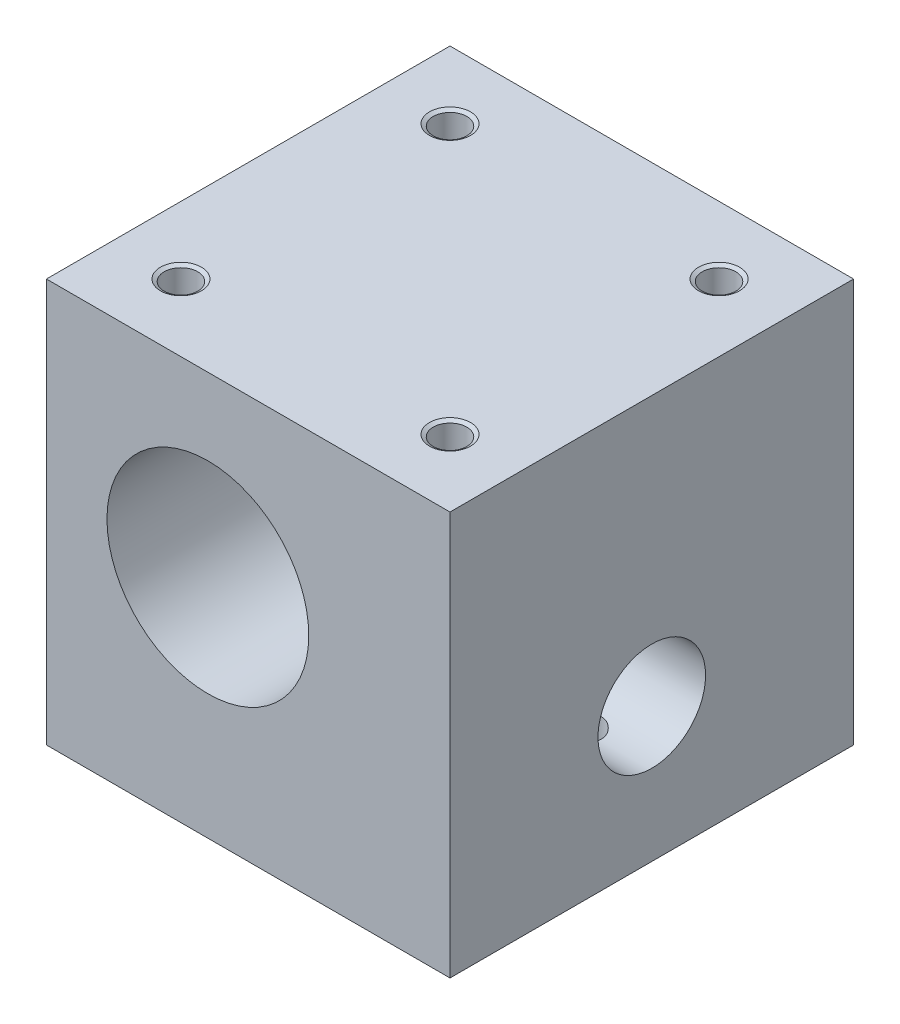
ISO-10303-21;
HEADER;
FILE_DESCRIPTION(('STEP AP214'),'2;1');
FILE_NAME('part.step','',(''),(''),'','','');
FILE_SCHEMA(('AUTOMOTIVE_DESIGN { 1 0 10303 214 1 1 1 1 }'));
ENDSEC;
DATA;
#1=APPLICATION_CONTEXT('core data for automotive mechanical design processes');
#2=APPLICATION_PROTOCOL_DEFINITION('international standard','automotive_design',2000,#1);
#3=PRODUCT_CONTEXT('',#1,'mechanical');
#4=PRODUCT('Part','Part','',(#3));
#5=PRODUCT_RELATED_PRODUCT_CATEGORY('part','',(#4));
#6=PRODUCT_DEFINITION_FORMATION('','',#4);
#7=PRODUCT_DEFINITION_CONTEXT('part definition',#1,'design');
#8=PRODUCT_DEFINITION('design','',#6,#7);
#9=PRODUCT_DEFINITION_SHAPE('','',#8);
#10=(LENGTH_UNIT() NAMED_UNIT(*) SI_UNIT(.MILLI.,.METRE.));
#11=(NAMED_UNIT(*) PLANE_ANGLE_UNIT() SI_UNIT($,.RADIAN.));
#12=(NAMED_UNIT(*) SI_UNIT($,.STERADIAN.) SOLID_ANGLE_UNIT());
#13=UNCERTAINTY_MEASURE_WITH_UNIT(LENGTH_MEASURE(1.E-05),#10,'distance_accuracy_value','');
#14=(GEOMETRIC_REPRESENTATION_CONTEXT(3) GLOBAL_UNCERTAINTY_ASSIGNED_CONTEXT((#13)) GLOBAL_UNIT_ASSIGNED_CONTEXT((#10,
#11,#12)) REPRESENTATION_CONTEXT('',''));
#15=CARTESIAN_POINT('',(0.,0.,0.));
#16=DIRECTION('',(0.,0.,1.));
#17=DIRECTION('',(1.,0.,0.));
#18=AXIS2_PLACEMENT_3D('',#15,#16,#17);
#19=CARTESIAN_POINT('',(0.,0.,30.));
#20=DIRECTION('',(0.,0.,-1.));
#21=DIRECTION('',(-1.,0.,0.));
#22=AXIS2_PLACEMENT_3D('',#19,#20,#21);
#23=PLANE('',#22);
#24=DIRECTION('',(0.,-1.,0.));
#25=VECTOR('',#24,1.);
#26=CARTESIAN_POINT('',(0.,0.,30.));
#27=LINE('',#26,#25);
#28=CARTESIAN_POINT('',(0.,30.,30.));
#29=VERTEX_POINT('',#28);
#30=CARTESIAN_POINT('',(0.,0.,30.));
#31=VERTEX_POINT('',#30);
#32=EDGE_CURVE('E180',#29,#31,#27,.T.);
#33=ORIENTED_EDGE('',*,*,#32,.T.);
#34=DIRECTION('',(1.,0.,0.));
#35=VECTOR('',#34,1.);
#36=CARTESIAN_POINT('',(0.,0.,30.));
#37=LINE('',#36,#35);
#38=CARTESIAN_POINT('',(30.,0.,30.));
#39=VERTEX_POINT('',#38);
#40=EDGE_CURVE('E250',#31,#39,#37,.T.);
#41=ORIENTED_EDGE('',*,*,#40,.T.);
#42=DIRECTION('',(0.,1.,0.));
#43=VECTOR('',#42,1.);
#44=CARTESIAN_POINT('',(30.,0.,30.));
#45=LINE('',#44,#43);
#46=CARTESIAN_POINT('',(30.,30.,30.));
#47=VERTEX_POINT('',#46);
#48=EDGE_CURVE('E173',#39,#47,#45,.T.);
#49=ORIENTED_EDGE('',*,*,#48,.T.);
#50=DIRECTION('',(-1.,0.,0.));
#51=VECTOR('',#50,1.);
#52=CARTESIAN_POINT('',(0.,30.,30.));
#53=LINE('',#52,#51);
#54=EDGE_CURVE('E187',#47,#29,#53,.T.);
#55=ORIENTED_EDGE('',*,*,#54,.T.);
#56=EDGE_LOOP('',(#33,#41,#49,#55));
#57=FACE_BOUND('',#56,.T.);
#58=CARTESIAN_POINT('',(12.,16.8,30.));
#59=DIRECTION('',(0.,0.,1.));
#60=DIRECTION('',(1.,0.,0.));
#61=AXIS2_PLACEMENT_3D('',#58,#59,#60);
#62=CIRCLE('',#61,7.5);
#63=CARTESIAN_POINT('',(19.5,16.8,30.));
#64=VERTEX_POINT('',#63);
#65=EDGE_CURVE('E240',#64,#64,#62,.T.);
#66=ORIENTED_EDGE('',*,*,#65,.F.);
#67=EDGE_LOOP('',(#66));
#68=FACE_BOUND('',#67,.T.);
#69=ADVANCED_FACE('F36',(#57,#68),#23,.F.);
#70=CARTESIAN_POINT('',(0.,0.,0.));
#71=DIRECTION('',(0.,0.,-1.));
#72=DIRECTION('',(-1.,0.,0.));
#73=AXIS2_PLACEMENT_3D('',#70,#71,#72);
#74=PLANE('',#73);
#75=DIRECTION('',(0.,-1.,0.));
#76=VECTOR('',#75,1.);
#77=CARTESIAN_POINT('',(0.,0.,0.));
#78=LINE('',#77,#76);
#79=CARTESIAN_POINT('',(0.,30.,0.));
#80=VERTEX_POINT('',#79);
#81=CARTESIAN_POINT('',(0.,0.,0.));
#82=VERTEX_POINT('',#81);
#83=EDGE_CURVE('E168',#80,#82,#78,.T.);
#84=ORIENTED_EDGE('',*,*,#83,.F.);
#85=DIRECTION('',(-1.,0.,0.));
#86=VECTOR('',#85,1.);
#87=CARTESIAN_POINT('',(0.,30.,0.));
#88=LINE('',#87,#86);
#89=CARTESIAN_POINT('',(30.,30.,0.));
#90=VERTEX_POINT('',#89);
#91=EDGE_CURVE('E178',#90,#80,#88,.T.);
#92=ORIENTED_EDGE('',*,*,#91,.F.);
#93=DIRECTION('',(0.,1.,0.));
#94=VECTOR('',#93,1.);
#95=CARTESIAN_POINT('',(30.,0.,0.));
#96=LINE('',#95,#94);
#97=CARTESIAN_POINT('',(30.,0.,0.));
#98=VERTEX_POINT('',#97);
#99=EDGE_CURVE('E167',#98,#90,#96,.T.);
#100=ORIENTED_EDGE('',*,*,#99,.F.);
#101=DIRECTION('',(1.,0.,0.));
#102=VECTOR('',#101,1.);
#103=CARTESIAN_POINT('',(0.,0.,0.));
#104=LINE('',#103,#102);
#105=EDGE_CURVE('E158',#82,#98,#104,.T.);
#106=ORIENTED_EDGE('',*,*,#105,.F.);
#107=EDGE_LOOP('',(#84,#92,#100,#106));
#108=FACE_BOUND('',#107,.T.);
#109=CARTESIAN_POINT('',(12.,16.8,0.));
#110=DIRECTION('',(0.,0.,1.));
#111=DIRECTION('',(1.,0.,0.));
#112=AXIS2_PLACEMENT_3D('',#109,#110,#111);
#113=CIRCLE('',#112,7.5);
#114=CARTESIAN_POINT('',(19.5,16.8,0.));
#115=VERTEX_POINT('',#114);
#116=EDGE_CURVE('E236',#115,#115,#113,.T.);
#117=ORIENTED_EDGE('',*,*,#116,.T.);
#118=EDGE_LOOP('',(#117));
#119=FACE_BOUND('',#118,.T.);
#120=ADVANCED_FACE('F123',(#108,#119),#74,.T.);
#121=CARTESIAN_POINT('',(0.,0.,30.));
#122=DIRECTION('',(1.,0.,0.));
#123=DIRECTION('',(0.,0.,-1.));
#124=AXIS2_PLACEMENT_3D('',#121,#122,#123);
#125=PLANE('',#124);
#126=ORIENTED_EDGE('',*,*,#83,.T.);
#127=DIRECTION('',(0.,0.,-1.));
#128=VECTOR('',#127,1.);
#129=CARTESIAN_POINT('',(0.,0.,30.));
#130=LINE('',#129,#128);
#131=EDGE_CURVE('E163',#31,#82,#130,.T.);
#132=ORIENTED_EDGE('',*,*,#131,.F.);
#133=ORIENTED_EDGE('',*,*,#32,.F.);
#134=DIRECTION('',(0.,0.,-1.));
#135=VECTOR('',#134,1.);
#136=CARTESIAN_POINT('',(0.,30.,30.));
#137=LINE('',#136,#135);
#138=EDGE_CURVE('E184',#29,#80,#137,.T.);
#139=ORIENTED_EDGE('',*,*,#138,.T.);
#140=EDGE_LOOP('',(#126,#132,#133,#139));
#141=FACE_BOUND('',#140,.T.);
#142=ADVANCED_FACE('F38',(#141),#125,.F.);
#143=CARTESIAN_POINT('',(0.,0.,30.));
#144=DIRECTION('',(0.,1.,0.));
#145=DIRECTION('',(0.,0.,1.));
#146=AXIS2_PLACEMENT_3D('',#143,#144,#145);
#147=PLANE('',#146);
#148=CARTESIAN_POINT('',(25.,0.,15.));
#149=DIRECTION('',(0.,-1.,0.));
#150=DIRECTION('',(0.,0.,-1.));
#151=AXIS2_PLACEMENT_3D('',#148,#149,#150);
#152=CIRCLE('',#151,1.525);
#153=CARTESIAN_POINT('',(25.,0.,13.475));
#154=VERTEX_POINT('',#153);
#155=EDGE_CURVE('E155',#154,#154,#152,.T.);
#156=ORIENTED_EDGE('',*,*,#155,.F.);
#157=EDGE_LOOP('',(#156));
#158=FACE_BOUND('',#157,.T.);
#159=ORIENTED_EDGE('',*,*,#105,.T.);
#160=DIRECTION('',(0.,0.,-1.));
#161=VECTOR('',#160,1.);
#162=CARTESIAN_POINT('',(30.,0.,30.));
#163=LINE('',#162,#161);
#164=EDGE_CURVE('E160',#39,#98,#163,.T.);
#165=ORIENTED_EDGE('',*,*,#164,.F.);
#166=ORIENTED_EDGE('',*,*,#40,.F.);
#167=ORIENTED_EDGE('',*,*,#131,.T.);
#168=EDGE_LOOP('',(#159,#165,#166,#167));
#169=FACE_BOUND('',#168,.T.);
#170=ADVANCED_FACE('F144',(#158,#169),#147,.F.);
#171=CARTESIAN_POINT('',(30.,0.,30.));
#172=DIRECTION('',(-1.,0.,0.));
#173=DIRECTION('',(0.,0.,1.));
#174=AXIS2_PLACEMENT_3D('',#171,#172,#173);
#175=PLANE('',#174);
#176=CARTESIAN_POINT('',(30.,10.,15.));
#177=DIRECTION('',(1.,0.,0.));
#178=DIRECTION('',(0.,0.,-1.));
#179=AXIS2_PLACEMENT_3D('',#176,#177,#178);
#180=CIRCLE('',#179,4.);
#181=CARTESIAN_POINT('',(30.,10.,11.));
#182=VERTEX_POINT('',#181);
#183=EDGE_CURVE('E237',#182,#182,#180,.T.);
#184=ORIENTED_EDGE('',*,*,#183,.F.);
#185=EDGE_LOOP('',(#184));
#186=FACE_BOUND('',#185,.T.);
#187=ORIENTED_EDGE('',*,*,#99,.T.);
#188=DIRECTION('',(0.,0.,-1.));
#189=VECTOR('',#188,1.);
#190=CARTESIAN_POINT('',(30.,30.,30.));
#191=LINE('',#190,#189);
#192=EDGE_CURVE('E174',#47,#90,#191,.T.);
#193=ORIENTED_EDGE('',*,*,#192,.F.);
#194=ORIENTED_EDGE('',*,*,#48,.F.);
#195=ORIENTED_EDGE('',*,*,#164,.T.);
#196=EDGE_LOOP('',(#187,#193,#194,#195));
#197=FACE_BOUND('',#196,.T.);
#198=ADVANCED_FACE('F141',(#186,#197),#175,.F.);
#199=CARTESIAN_POINT('',(0.,30.,30.));
#200=DIRECTION('',(0.,-1.,0.));
#201=DIRECTION('',(0.,0.,-1.));
#202=AXIS2_PLACEMENT_3D('',#199,#200,#201);
#203=PLANE('',#202);
#204=CARTESIAN_POINT('',(5.,30.,5.));
#205=DIRECTION('',(0.,1.,0.));
#206=DIRECTION('',(0.,0.,1.));
#207=AXIS2_PLACEMENT_3D('',#204,#205,#206);
#208=CIRCLE('',#207,1.525);
#209=CARTESIAN_POINT('',(5.,30.,6.525));
#210=VERTEX_POINT('',#209);
#211=EDGE_CURVE('E289',#210,#210,#208,.T.);
#212=ORIENTED_EDGE('',*,*,#211,.F.);
#213=EDGE_LOOP('',(#212));
#214=FACE_BOUND('',#213,.T.);
#215=CARTESIAN_POINT('',(25.,30.,5.));
#216=DIRECTION('',(0.,1.,0.));
#217=DIRECTION('',(0.,0.,1.));
#218=AXIS2_PLACEMENT_3D('',#215,#216,#217);
#219=CIRCLE('',#218,1.525);
#220=CARTESIAN_POINT('',(25.,30.,6.525));
#221=VERTEX_POINT('',#220);
#222=EDGE_CURVE('E282',#221,#221,#219,.T.);
#223=ORIENTED_EDGE('',*,*,#222,.F.);
#224=EDGE_LOOP('',(#223));
#225=FACE_BOUND('',#224,.T.);
#226=CARTESIAN_POINT('',(5.,30.,25.));
#227=DIRECTION('',(0.,1.,0.));
#228=DIRECTION('',(0.,0.,1.));
#229=AXIS2_PLACEMENT_3D('',#226,#227,#228);
#230=CIRCLE('',#229,1.525);
#231=CARTESIAN_POINT('',(5.,30.,26.525));
#232=VERTEX_POINT('',#231);
#233=EDGE_CURVE('E273',#232,#232,#230,.T.);
#234=ORIENTED_EDGE('',*,*,#233,.F.);
#235=EDGE_LOOP('',(#234));
#236=FACE_BOUND('',#235,.T.);
#237=CARTESIAN_POINT('',(25.,30.,25.));
#238=DIRECTION('',(0.,1.,0.));
#239=DIRECTION('',(0.,0.,1.));
#240=AXIS2_PLACEMENT_3D('',#237,#238,#239);
#241=CIRCLE('',#240,1.525);
#242=CARTESIAN_POINT('',(25.,30.,26.525));
#243=VERTEX_POINT('',#242);
#244=EDGE_CURVE('E266',#243,#243,#241,.T.);
#245=ORIENTED_EDGE('',*,*,#244,.F.);
#246=EDGE_LOOP('',(#245));
#247=FACE_BOUND('',#246,.T.);
#248=ORIENTED_EDGE('',*,*,#91,.T.);
#249=ORIENTED_EDGE('',*,*,#138,.F.);
#250=ORIENTED_EDGE('',*,*,#54,.F.);
#251=ORIENTED_EDGE('',*,*,#192,.T.);
#252=EDGE_LOOP('',(#248,#249,#250,#251));
#253=FACE_BOUND('',#252,.T.);
#254=ADVANCED_FACE('F138',(#214,#225,#236,#247,#253),#203,.F.);
#255=CARTESIAN_POINT('',(12.,16.8,30.));
#256=DIRECTION('',(0.,0.,-1.));
#257=DIRECTION('',(-1.,0.,0.));
#258=AXIS2_PLACEMENT_3D('',#255,#256,#257);
#259=CYLINDRICAL_SURFACE('',#258,7.5);
#260=CARTESIAN_POINT('',(6.15534432151902,21.5,4.52284227059205));
#261=CARTESIAN_POINT('',(6.16362153761363,21.5102931554817,4.54288444067307));
#262=CARTESIAN_POINT('',(6.17147971618083,21.5200094160731,4.56339086462607));
#263=CARTESIAN_POINT('',(6.1862557347056,21.5381973997216,4.60529478716495));
#264=CARTESIAN_POINT('',(6.19317286133672,21.5466681790803,4.62669294582164));
#265=CARTESIAN_POINT('',(6.21237214875742,21.5700917117068,4.69222819785899));
#266=CARTESIAN_POINT('',(6.22306093876,21.583004682019,4.73760819095702));
#267=CARTESIAN_POINT('',(6.23940051070501,21.6026723537389,4.83078590960006));
#268=CARTESIAN_POINT('',(6.24502869808829,21.6093994394315,4.8785934811963));
#269=CARTESIAN_POINT('',(6.25067548370002,21.6161487381445,4.9749119273379));
#270=CARTESIAN_POINT('',(6.25070741646644,21.6161868892981,5.02342085462017));
#271=CARTESIAN_POINT('',(6.24534683836426,21.6097796942061,5.11700571737061));
#272=CARTESIAN_POINT('',(6.24025068882713,21.6036885701281,5.16212438424396));
#273=CARTESIAN_POINT('',(6.22545904043856,21.5858968207992,5.2505201764454));
#274=CARTESIAN_POINT('',(6.21575729031553,21.574188571084,5.29379471143415));
#275=CARTESIAN_POINT('',(6.19721467515022,21.5516100938307,5.36032961237828));
#276=CARTESIAN_POINT('',(6.18964939445748,21.5423615721806,5.38452638850156));
#277=CARTESIAN_POINT('',(6.17334225796207,21.5223115210112,5.43172753423919));
#278=CARTESIAN_POINT('',(6.16460544663524,21.5115166370427,5.45473646071104));
#279=CARTESIAN_POINT('',(6.15534432151902,21.5,5.47715772940795));
#280=B_SPLINE_CURVE_WITH_KNOTS('',3,(#260,#261,#262,#263,#264,#265,#266,#267,#268,#269,#270,
#271,#272,#273,#274,#275,#276,#277,#278,#279),.UNSPECIFIED.,.F.,.F.,(4,2,2,2,2,2,2,2,2,4),(0.,
0.0719817745893099,0.144017811616094,0.288439597100801,0.433503039855102,0.57822082636545,
0.715029495979442,0.852024391935102,0.932896140821414,1.0134302235939),.UNSPECIFIED.);
#281=CARTESIAN_POINT('',(6.15534432151902,21.5,4.52284227059205));
#282=VERTEX_POINT('',#281);
#283=CARTESIAN_POINT('',(6.15534432151902,21.5,5.47715772940795));
#284=VERTEX_POINT('',#283);
#285=EDGE_CURVE('E11',#282,#284,#280,.T.);
#286=ORIENTED_EDGE('',*,*,#285,.F.);
#287=CARTESIAN_POINT('',(6.97211373089564,22.3651019456028,6.82910844802124));
#288=CARTESIAN_POINT('',(6.93552380900419,22.3320431119959,6.78764889123442));
#289=CARTESIAN_POINT('',(6.89972062046699,22.2990414950944,6.74546339117701));
#290=CARTESIAN_POINT('',(6.82964181063816,22.2332045657905,6.65971226580268));
#291=CARTESIAN_POINT('',(6.79536624364262,22.2003692593359,6.6161465915244));
#292=CARTESIAN_POINT('',(6.69435611651946,22.101794199661,6.48295105672981));
#293=CARTESIAN_POINT('',(6.62988433652131,22.0363906500908,6.39133107847354));
#294=CARTESIAN_POINT('',(6.53506534661061,21.9368119571168,6.24592550847061));
#295=CARTESIAN_POINT('',(6.50257080432123,21.9020050134257,6.19395236388325));
#296=CARTESIAN_POINT('',(6.43947476439617,21.8331636482719,6.08837422074716));
#297=CARTESIAN_POINT('',(6.40887298619951,21.7991291127923,6.03476946581519));
#298=CARTESIAN_POINT('',(6.34983186675059,21.7322999601225,5.92584922780528));
#299=CARTESIAN_POINT('',(6.3213873405663,21.6995024717738,5.87053832715317));
#300=CARTESIAN_POINT('',(6.26698145702197,21.635725995575,5.75770739179119));
#301=CARTESIAN_POINT('',(6.24101850863125,21.6047458475508,5.70018880612114));
#302=CARTESIAN_POINT('',(6.20377530537922,21.5596423961049,5.60983212448043));
#303=CARTESIAN_POINT('',(6.19130874524349,21.5444138274108,5.57803752800188));
#304=CARTESIAN_POINT('',(6.16752939611152,21.5151501480163,5.51345920877797));
#305=CARTESIAN_POINT('',(6.15621697451306,21.5011154175862,5.48067517534129));
#306=CARTESIAN_POINT('',(6.13516465099081,21.4748248437671,5.41429021947142));
#307=CARTESIAN_POINT('',(6.12541064885956,21.4625531646384,5.38070021030111));
#308=CARTESIAN_POINT('',(6.10778665993913,21.4402611641695,5.3123151934471));
#309=CARTESIAN_POINT('',(6.09991519427973,21.4302390759936,5.27752115637706));
#310=CARTESIAN_POINT('',(6.08493865023928,21.4110990115013,5.19778602853412));
#311=CARTESIAN_POINT('',(6.07852182416698,21.4028393422866,5.1524900536665));
#312=CARTESIAN_POINT('',(6.07066629658606,21.3927170715204,5.06082931563784));
#313=CARTESIAN_POINT('',(6.06921293465356,21.3908356309219,5.01446810792148));
#314=CARTESIAN_POINT('',(6.07158554539452,21.3938984048691,4.92212515101201));
#315=CARTESIAN_POINT('',(6.07541229103706,21.398843618787,4.87614345836851));
#316=CARTESIAN_POINT('',(6.08754303939382,21.4144279748739,4.78568495514825));
#317=CARTESIAN_POINT('',(6.09586397382375,21.4250886487327,4.74121451601051));
#318=CARTESIAN_POINT('',(6.11952787247192,21.4551614256659,4.63789563687565));
#319=CARTESIAN_POINT('',(6.13633474547383,21.4763569084703,4.57992827118491));
#320=CARTESIAN_POINT('',(6.16448571328166,21.5113696246306,4.49539024086866));
#321=CARTESIAN_POINT('',(6.17436841674006,21.5235879979045,4.46759214416626));
#322=CARTESIAN_POINT('',(6.19495690851436,21.5488671546031,4.41269069629293));
#323=CARTESIAN_POINT('',(6.20566257743157,21.5619278157817,4.38558724509838));
#324=CARTESIAN_POINT('',(6.23765261336005,21.6006698859378,4.30798082594215));
#325=CARTESIAN_POINT('',(6.25982448834526,21.6271787845953,4.25826022085521));
#326=CARTESIAN_POINT('',(6.30607838045641,21.6816534222312,4.16052612167515));
#327=CARTESIAN_POINT('',(6.33016125391932,21.7096198123771,4.11251340702082));
#328=CARTESIAN_POINT('',(6.40487507141378,21.7950260302758,3.97045920097323));
#329=CARTESIAN_POINT('',(6.45791116269505,21.8538994179731,3.87854046989412));
#330=CARTESIAN_POINT('',(6.56945495831247,21.9735785644285,3.69919155179047));
#331=CARTESIAN_POINT('',(6.62797139916085,22.0343873029607,3.61176888799433));
#332=CARTESIAN_POINT('',(6.75021528536041,22.1569809714518,3.44152454351275));
#333=CARTESIAN_POINT('',(6.81393708706568,22.2187647870844,3.35869803914134));
#334=CARTESIAN_POINT('',(6.90268171523041,22.3016615464947,3.25132814435654));
#335=CARTESIAN_POINT('',(6.92530822232228,22.3225417379871,3.22460010887506));
#336=CARTESIAN_POINT('',(6.97113223203624,22.3643011181351,3.17178884937525));
#337=CARTESIAN_POINT('',(6.99432824352729,22.3851801903238,3.14570423905798));
#338=CARTESIAN_POINT('',(7.01784337016,22.4060784257573,3.11992176973608));
#339=B_SPLINE_CURVE_WITH_KNOTS('',3,(#287,#288,#289,#290,#291,#292,#293,#294,#295,#296,#297,
#298,#299,#300,#301,#302,#303,#304,#305,#306,#307,#308,#309,#310,#311,#312,#313,#314,#315,#316,
#317,#318,#319,#320,#321,#322,#323,#324,#325,#326,#327,#328,#329,#330,#331,#332,#333,#334,#335,
#336,#337,#338),.UNSPECIFIED.,.F.,.F.,(4,2,2,2,2,2,2,2,2,2,2,2,2,2,2,2,2,2,2,2,2,2,2,2,2,4),(0.,
0.19325008697597,0.386507037147898,0.775382757155096,0.986813547848952,1.19821292306154,
1.40908694463462,1.61982484726931,1.73196620026594,1.84414314064401,1.95523932668036,
2.06624794972933,2.20511924054482,2.34357999528715,2.48206102182053,2.62106744805235,
2.81234138300648,2.90812922804472,3.00390320198481,3.18544971620653,3.36707804764857,
3.73083768829957,4.09518742174442,4.45914724118925,4.58145556228019,4.70347206957313),.UNSPECIFIED.);
#340=EDGE_CURVE('E49',#284,#282,#339,.T.);
#341=ORIENTED_EDGE('',*,*,#340,.F.);
#342=EDGE_LOOP('',(#286,#341));
#343=FACE_BOUND('',#342,.T.);
#344=CARTESIAN_POINT('',(6.15534432151902,21.5,24.522842270592));
#345=CARTESIAN_POINT('',(6.16362153761363,21.5102931554817,24.5428844406731));
#346=CARTESIAN_POINT('',(6.17147971618083,21.5200094160731,24.5633908646261));
#347=CARTESIAN_POINT('',(6.1862557347056,21.5381973997216,24.6052947871649));
#348=CARTESIAN_POINT('',(6.19317286133672,21.5466681790803,24.6266929458216));
#349=CARTESIAN_POINT('',(6.21237214875742,21.5700917117068,24.692228197859));
#350=CARTESIAN_POINT('',(6.22306093876,21.583004682019,24.737608190957));
#351=CARTESIAN_POINT('',(6.23940051070501,21.6026723537389,24.8307859096001));
#352=CARTESIAN_POINT('',(6.24502869808829,21.6093994394315,24.8785934811963));
#353=CARTESIAN_POINT('',(6.25067548370002,21.6161487381445,24.9749119273379));
#354=CARTESIAN_POINT('',(6.25070741646644,21.6161868892981,25.0234208546202));
#355=CARTESIAN_POINT('',(6.24534683836426,21.6097796942061,25.1170057173706));
#356=CARTESIAN_POINT('',(6.24025068882713,21.6036885701281,25.162124384244));
#357=CARTESIAN_POINT('',(6.22545904043856,21.5858968207992,25.2505201764454));
#358=CARTESIAN_POINT('',(6.21575729031553,21.574188571084,25.2937947114341));
#359=CARTESIAN_POINT('',(6.19721467515022,21.5516100938307,25.3603296123783));
#360=CARTESIAN_POINT('',(6.18964939445748,21.5423615721806,25.3845263885016));
#361=CARTESIAN_POINT('',(6.17334225796207,21.5223115210112,25.4317275342392));
#362=CARTESIAN_POINT('',(6.16460544663524,21.5115166370427,25.454736460711));
#363=CARTESIAN_POINT('',(6.15534432151902,21.5,25.4771577294079));
#364=B_SPLINE_CURVE_WITH_KNOTS('',3,(#344,#345,#346,#347,#348,#349,#350,#351,#352,#353,#354,
#355,#356,#357,#358,#359,#360,#361,#362,#363),.UNSPECIFIED.,.F.,.F.,(4,2,2,2,2,2,2,2,2,4),(0.,
0.0719817745893117,0.144017811616093,0.288439597100801,0.433503039855102,0.578220826365449,
0.715029495979442,0.8520243919351,0.932896140821416,1.0134302235939),.UNSPECIFIED.);
#365=CARTESIAN_POINT('',(6.15534432151902,21.5,24.522842270592));
#366=VERTEX_POINT('',#365);
#367=CARTESIAN_POINT('',(6.15534432151902,21.5,25.4771577294079));
#368=VERTEX_POINT('',#367);
#369=EDGE_CURVE('E196',#366,#368,#364,.T.);
#370=ORIENTED_EDGE('',*,*,#369,.F.);
#371=CARTESIAN_POINT('',(6.97211373089563,22.3651019456028,26.8291084480212));
#372=CARTESIAN_POINT('',(6.93552380900418,22.3320431119959,26.7876488912344));
#373=CARTESIAN_POINT('',(6.89972062046697,22.2990414950944,26.745463391177));
#374=CARTESIAN_POINT('',(6.82964181063815,22.2332045657905,26.6597122658027));
#375=CARTESIAN_POINT('',(6.79536624364261,22.2003692593359,26.6161465915244));
#376=CARTESIAN_POINT('',(6.69435611651945,22.1017941996609,26.4829510567298));
#377=CARTESIAN_POINT('',(6.6298843365213,22.0363906500908,26.3913310784735));
#378=CARTESIAN_POINT('',(6.53506534661061,21.9368119571168,26.2459255084706));
#379=CARTESIAN_POINT('',(6.50257080432123,21.9020050134257,26.1939523638832));
#380=CARTESIAN_POINT('',(6.43947476439616,21.8331636482719,26.0883742207472));
#381=CARTESIAN_POINT('',(6.40887298619951,21.7991291127923,26.0347694658152));
#382=CARTESIAN_POINT('',(6.34983186675059,21.7322999601225,25.9258492278053));
#383=CARTESIAN_POINT('',(6.3213873405663,21.6995024717738,25.8705383271532));
#384=CARTESIAN_POINT('',(6.26698145702197,21.635725995575,25.7577073917912));
#385=CARTESIAN_POINT('',(6.24101850863125,21.6047458475508,25.7001888061211));
#386=CARTESIAN_POINT('',(6.20377530537922,21.5596423961049,25.6098321244804));
#387=CARTESIAN_POINT('',(6.19130874524349,21.5444138274108,25.5780375280019));
#388=CARTESIAN_POINT('',(6.16752939611152,21.5151501480163,25.513459208778));
#389=CARTESIAN_POINT('',(6.15621697451306,21.5011154175862,25.4806751753413));
#390=CARTESIAN_POINT('',(6.13516465099081,21.474824843767,25.4142902194714));
#391=CARTESIAN_POINT('',(6.12541064885956,21.4625531646384,25.3807002103011));
#392=CARTESIAN_POINT('',(6.10778665993913,21.4402611641695,25.3123151934471));
#393=CARTESIAN_POINT('',(6.09991519427973,21.4302390759936,25.2775211563771));
#394=CARTESIAN_POINT('',(6.08493865023928,21.4110990115013,25.1977860285341));
#395=CARTESIAN_POINT('',(6.07852182416698,21.4028393422866,25.1524900536665));
#396=CARTESIAN_POINT('',(6.07066629658606,21.3927170715204,25.0608293156378));
#397=CARTESIAN_POINT('',(6.06921293465356,21.3908356309219,25.0144681079215));
#398=CARTESIAN_POINT('',(6.07158554539452,21.3938984048691,24.922125151012));
#399=CARTESIAN_POINT('',(6.07541229103706,21.398843618787,24.8761434583685));
#400=CARTESIAN_POINT('',(6.08754303939383,21.4144279748739,24.7856849551482));
#401=CARTESIAN_POINT('',(6.09586397382375,21.4250886487327,24.7412145160105));
#402=CARTESIAN_POINT('',(6.11952787247192,21.4551614256659,24.6378956368756));
#403=CARTESIAN_POINT('',(6.13633474547383,21.4763569084703,24.5799282711849));
#404=CARTESIAN_POINT('',(6.16448571328166,21.5113696246306,24.4953902408687));
#405=CARTESIAN_POINT('',(6.17436841674006,21.5235879979045,24.4675921441663));
#406=CARTESIAN_POINT('',(6.19495690851435,21.5488671546031,24.4126906962929));
#407=CARTESIAN_POINT('',(6.20566257743157,21.5619278157817,24.3855872450984));
#408=CARTESIAN_POINT('',(6.23765261336005,21.6006698859378,24.3079808259422));
#409=CARTESIAN_POINT('',(6.25982448834526,21.6271787845953,24.2582602208552));
#410=CARTESIAN_POINT('',(6.30607838045641,21.6816534222312,24.1605261216752));
#411=CARTESIAN_POINT('',(6.33016125391931,21.7096198123771,24.1125134070208));
#412=CARTESIAN_POINT('',(6.40487507141377,21.7950260302758,23.9704592009732));
#413=CARTESIAN_POINT('',(6.45791116269505,21.8538994179731,23.8785404698941));
#414=CARTESIAN_POINT('',(6.56945495831247,21.9735785644285,23.6991915517905));
#415=CARTESIAN_POINT('',(6.62797139916085,22.0343873029607,23.6117688879943));
#416=CARTESIAN_POINT('',(6.7502152853604,22.1569809714518,23.4415245435128));
#417=CARTESIAN_POINT('',(6.81393708706567,22.2187647870844,23.3586980391413));
#418=CARTESIAN_POINT('',(6.9026817152304,22.3016615464947,23.2513281443565));
#419=CARTESIAN_POINT('',(6.92530822232228,22.3225417379871,23.2246001088751));
#420=CARTESIAN_POINT('',(6.97113223203624,22.3643011181351,23.1717888493753));
#421=CARTESIAN_POINT('',(6.99432824352729,22.3851801903238,23.145704239058));
#422=CARTESIAN_POINT('',(7.01784337016,22.4060784257573,23.1199217697361));
#423=B_SPLINE_CURVE_WITH_KNOTS('',3,(#371,#372,#373,#374,#375,#376,#377,#378,#379,#380,#381,
#382,#383,#384,#385,#386,#387,#388,#389,#390,#391,#392,#393,#394,#395,#396,#397,#398,#399,#400,
#401,#402,#403,#404,#405,#406,#407,#408,#409,#410,#411,#412,#413,#414,#415,#416,#417,#418,#419,
#420,#421,#422),.UNSPECIFIED.,.F.,.F.,(4,2,2,2,2,2,2,2,2,2,2,2,2,2,2,2,2,2,2,2,2,2,2,2,2,4),(0.,
0.193250086975967,0.386507037147898,0.77538275715509,0.986813547848945,1.19821292306153,
1.4090869446346,1.61982484726929,1.73196620026593,1.844143140644,1.95523932668035,
2.06624794972931,2.2051192405448,2.34357999528713,2.48206102182051,2.62106744805234,
2.81234138300646,2.9081292280447,3.00390320198478,3.1854497162065,3.36707804764855,
3.73083768829954,4.09518742174439,4.45914724118922,4.58145556228017,4.70347206957311),.UNSPECIFIED.);
#424=EDGE_CURVE('E190',#368,#366,#423,.T.);
#425=ORIENTED_EDGE('',*,*,#424,.F.);
#426=EDGE_LOOP('',(#370,#425));
#427=FACE_BOUND('',#426,.T.);
#428=ORIENTED_EDGE('',*,*,#65,.T.);
#429=EDGE_LOOP('',(#428));
#430=FACE_BOUND('',#429,.T.);
#431=ORIENTED_EDGE('',*,*,#116,.F.);
#432=EDGE_LOOP('',(#431));
#433=FACE_BOUND('',#432,.T.);
#434=ADVANCED_FACE('F134',(#343,#427,#430,#433),#259,.F.);
#435=CARTESIAN_POINT('',(20.,10.,15.));
#436=DIRECTION('',(1.,0.,0.));
#437=DIRECTION('',(0.,0.,-1.));
#438=AXIS2_PLACEMENT_3D('',#435,#436,#437);
#439=CONICAL_SURFACE('',#438,4.,1.02974425867665);
#440=CARTESIAN_POINT('',(17.5965575238898,10.,15.));
#441=VERTEX_POINT('',#440);
#442=VERTEX_LOOP('',#441);
#443=FACE_BOUND('',#442,.T.);
#444=CARTESIAN_POINT('',(20.,10.,15.));
#445=DIRECTION('',(1.,0.,0.));
#446=DIRECTION('',(0.,0.,-1.));
#447=AXIS2_PLACEMENT_3D('',#444,#445,#446);
#448=CIRCLE('',#447,4.);
#449=CARTESIAN_POINT('',(20.,10.,11.));
#450=VERTEX_POINT('',#449);
#451=EDGE_CURVE('E234',#450,#450,#448,.T.);
#452=ORIENTED_EDGE('',*,*,#451,.T.);
#453=EDGE_LOOP('',(#452));
#454=FACE_BOUND('',#453,.T.);
#455=ADVANCED_FACE('F223',(#443,#454),#439,.F.);
#456=CARTESIAN_POINT('',(30.,10.,15.));
#457=DIRECTION('',(1.,0.,0.));
#458=DIRECTION('',(0.,0.,-1.));
#459=AXIS2_PLACEMENT_3D('',#456,#457,#458);
#460=CYLINDRICAL_SURFACE('',#459,4.);
#461=CARTESIAN_POINT('',(25.,6.20032896160733,13.75));
#462=CARTESIAN_POINT('',(25.0683470361093,6.20032854038064,13.7500004621995));
#463=CARTESIAN_POINT('',(25.1366987687032,6.19846468494957,13.7556246120851));
#464=CARTESIAN_POINT('',(25.2713941608778,6.19124361001123,13.7779082459867));
#465=CARTESIAN_POINT('',(25.3377372727322,6.18588544646864,13.7945707121749));
#466=CARTESIAN_POINT('',(25.466444901932,6.1723406116404,13.8383021177644));
#467=CARTESIAN_POINT('',(25.5288162331057,6.16415894805683,13.8653526426332));
#468=CARTESIAN_POINT('',(25.648152695864,6.14589593781312,13.9290308582684));
#469=CARTESIAN_POINT('',(25.7051168699601,6.13581425564159,13.9656602409437));
#470=CARTESIAN_POINT('',(25.8139788674935,6.1144987233138,14.0488039293777));
#471=CARTESIAN_POINT('',(25.865663609436,6.1032387661522,14.0955906002796));
#472=CARTESIAN_POINT('',(25.9605960132092,6.08105754139664,14.1971379535445));
#473=CARTESIAN_POINT('',(26.0038424969448,6.07013632127373,14.2518997474814));
#474=CARTESIAN_POINT('',(26.0816110630112,6.04956446609922,14.3693740875066));
#475=CARTESIAN_POINT('',(26.1159137038314,6.0399481543722,14.4322384434799));
#476=CARTESIAN_POINT('',(26.1733760498555,6.02337448166981,14.5631957671466));
#477=CARTESIAN_POINT('',(26.1965383741496,6.01641649580081,14.6312875015129));
#478=CARTESIAN_POINT('',(26.2303511280971,6.00612824179138,14.7685356430339));
#479=CARTESIAN_POINT('',(26.2413657497878,6.00269261015857,14.8375942845318));
#480=CARTESIAN_POINT('',(26.2517243464375,5.99946404123985,14.9766591860155));
#481=CARTESIAN_POINT('',(26.2510709743588,5.99967027589935,15.0466652269731));
#482=CARTESIAN_POINT('',(26.238351708414,6.00362883867463,15.1830744803547));
#483=CARTESIAN_POINT('',(26.226680616487,6.00725849027843,15.249518634314));
#484=CARTESIAN_POINT('',(26.192905009957,6.01750517439145,15.3794530633478));
#485=CARTESIAN_POINT('',(26.1707998149134,6.02412240172866,15.4429431454812));
#486=CARTESIAN_POINT('',(26.1165298109251,6.03976540270467,15.5660781031548));
#487=CARTESIAN_POINT('',(26.084245191437,6.04881966383043,15.6256664056228));
#488=CARTESIAN_POINT('',(26.0106289002954,6.06838277046438,15.738702511152));
#489=CARTESIAN_POINT('',(25.9692949408622,6.07889198355416,15.7921487562088));
#490=CARTESIAN_POINT('',(25.8767263651987,6.10076329265354,15.8937376984539));
#491=CARTESIAN_POINT('',(25.8251509311588,6.11214268010916,15.9415665490942));
#492=CARTESIAN_POINT('',(25.7146048981755,6.13409384559588,16.0279897425954));
#493=CARTESIAN_POINT('',(25.655633429425,6.14466552840153,16.0665829977534));
#494=CARTESIAN_POINT('',(25.5310825311402,6.16389153351026,16.1338046501976));
#495=CARTESIAN_POINT('',(25.4654365909576,6.17252309645676,16.1623168070268));
#496=CARTESIAN_POINT('',(25.3299405081046,6.18662454661087,16.2077834594851));
#497=CARTESIAN_POINT('',(25.2600918857895,6.19209556966706,16.2247421076579));
#498=CARTESIAN_POINT('',(25.1211800474342,6.19900436608128,16.2460148518571));
#499=CARTESIAN_POINT('',(25.0521980037679,6.20059533610304,16.2508095435371));
#500=CARTESIAN_POINT('',(24.9144102585018,6.19998922536015,16.2489674449831));
#501=CARTESIAN_POINT('',(24.8456045312995,6.1977927299161,16.2423324211146));
#502=CARTESIAN_POINT('',(24.7121917033484,6.19001042517126,16.2182487351314));
#503=CARTESIAN_POINT('',(24.647520725926,6.18452445898268,16.2011183116054));
#504=CARTESIAN_POINT('',(24.521978208004,6.17088712668339,16.1569037366103));
#505=CARTESIAN_POINT('',(24.4611072890788,6.16273532587612,16.1298179617115));
#506=CARTESIAN_POINT('',(24.3429608902283,6.14439460346844,16.0655751065587));
#507=CARTESIAN_POINT('',(24.2858385844072,6.13415396510267,16.0281514748856));
#508=CARTESIAN_POINT('',(24.1785096536381,6.11289651027172,15.9446064086798));
#509=CARTESIAN_POINT('',(24.1283048310747,6.10187949264297,15.8984827146908));
#510=CARTESIAN_POINT('',(24.0340896340872,6.07975812437321,15.7965729477536));
#511=CARTESIAN_POINT('',(23.9904222138601,6.06866907714321,15.7404656497885));
#512=CARTESIAN_POINT('',(23.9131089566787,6.04810940156322,15.6214515456514));
#513=CARTESIAN_POINT('',(23.879462660689,6.03863869909054,15.5585450511086));
#514=CARTESIAN_POINT('',(23.8234694375283,6.02243688071488,15.4281055233318));
#515=CARTESIAN_POINT('',(23.8010407121563,6.015686004388,15.3606101842838));
#516=CARTESIAN_POINT('',(23.7679274614103,6.00559757351424,15.2225572540564));
#517=CARTESIAN_POINT('',(23.7572392609165,6.00225895085723,15.1520006283404));
#518=CARTESIAN_POINT('',(23.7482089982504,5.99944196595539,15.0129849366489));
#519=CARTESIAN_POINT('',(23.7493715498292,5.9998087059261,14.9445608080535));
#520=CARTESIAN_POINT('',(23.7628118110487,6.00399021918952,14.8089267780768));
#521=CARTESIAN_POINT('',(23.775088795992,6.00780476767381,14.7417167978204));
#522=CARTESIAN_POINT('',(23.8100940092223,6.01840429155204,14.6112448815192));
#523=CARTESIAN_POINT('',(23.8326896078454,6.02515152039795,14.5479440815505));
#524=CARTESIAN_POINT('',(23.8875708272085,6.0409205441205,14.4260015744999));
#525=CARTESIAN_POINT('',(23.9198581099734,6.04994272908642,14.3673606687255));
#526=CARTESIAN_POINT('',(23.9944727583444,6.06970103116624,14.2542383050303));
#527=CARTESIAN_POINT('',(24.037103522464,6.08048490249038,14.1999653929469));
#528=CARTESIAN_POINT('',(24.1306598894435,6.10241263452939,14.0991792086007));
#529=CARTESIAN_POINT('',(24.1815879741394,6.11355660215173,14.0526682664958));
#530=CARTESIAN_POINT('',(24.2923157198411,6.13538107422562,13.9671713408875));
#531=CARTESIAN_POINT('',(24.3523534031166,6.14603399136544,13.9284857200529));
#532=CARTESIAN_POINT('',(24.4783981202691,6.16519874720469,13.8617952925148));
#533=CARTESIAN_POINT('',(24.5444027264503,6.17371145138613,13.8337861659645));
#534=CARTESIAN_POINT('',(24.6747226173147,6.18693439559672,13.7912881956421));
#535=CARTESIAN_POINT('',(24.7387025474516,6.19190684956251,13.7758506016213));
#536=CARTESIAN_POINT('',(24.8684538320965,6.19860393517601,13.755207541839));
#537=CARTESIAN_POINT('',(24.9342247412015,6.20032936698402,13.7499995551922));
#538=CARTESIAN_POINT('',(25.,6.20032896160733,13.75));
#539=B_SPLINE_CURVE_WITH_KNOTS('',3,(#461,#462,#463,#464,#465,#466,#467,#468,#469,#470,#471,
#472,#473,#474,#475,#476,#477,#478,#479,#480,#481,#482,#483,#484,#485,#486,#487,#488,#489,#490,
#491,#492,#493,#494,#495,#496,#497,#498,#499,#500,#501,#502,#503,#504,#505,#506,#507,#508,#509,
#510,#511,#512,#513,#514,#515,#516,#517,#518,#519,#520,#521,#522,#523,#524,#525,#526,#527,#528,
#529,#530,#531,#532,#533,#534,#535,#536,#537,#538),.UNSPECIFIED.,.T.,.F.,(4,2,2,2,2,2,2,2,2,2,2,
2,2,2,2,2,2,2,2,2,2,2,2,2,2,2,2,2,2,2,2,2,2,2,2,2,2,2,4),(0.,0.204798137548487,
0.409651627059732,0.614143644118576,0.818671804924945,1.02957080550838,1.24049922941122,
1.45619821963732,1.67184647417921,1.88083722835532,2.08978046471773,2.29150982969749,
2.49325235190092,2.69746404608408,2.90172742713186,3.11450338937332,3.32730439853774,
3.54248470934452,3.75758763952751,3.96404933287933,4.17047912219086,4.3709397204436,
4.57143302253207,4.77767613309607,4.98397288011877,5.19881937811508,5.41365603317083,
5.62690239290994,5.84008198140581,6.04438802439521,6.24868074692303,6.45041846514756,
6.65219079911648,6.86080693105211,7.06948557772186,7.285077955017,7.50058300803818,
7.69772354371381,7.89481549188774),.UNSPECIFIED.);
#540=CARTESIAN_POINT('',(25.,6.20032896160733,13.75));
#541=VERTEX_POINT('',#540);
#542=EDGE_CURVE('E40',#541,#541,#539,.T.);
#543=ORIENTED_EDGE('',*,*,#542,.T.);
#544=EDGE_LOOP('',(#543));
#545=FACE_BOUND('',#544,.T.);
#546=ORIENTED_EDGE('',*,*,#451,.F.);
#547=EDGE_LOOP('',(#546));
#548=FACE_BOUND('',#547,.T.);
#549=ORIENTED_EDGE('',*,*,#183,.T.);
#550=EDGE_LOOP('',(#549));
#551=FACE_BOUND('',#550,.T.);
#552=ADVANCED_FACE('F219',(#545,#548,#551),#460,.F.);
#553=CARTESIAN_POINT('',(25.,21.5,25.));
#554=DIRECTION('',(0.,1.,0.));
#555=DIRECTION('',(0.,0.,1.));
#556=AXIS2_PLACEMENT_3D('',#553,#554,#555);
#557=CONICAL_SURFACE('',#556,1.24999999999999,1.02974425867665);
#558=CARTESIAN_POINT('',(25.,20.7489242262155,25.));
#559=VERTEX_POINT('',#558);
#560=VERTEX_LOOP('',#559);
#561=FACE_BOUND('',#560,.T.);
#562=CARTESIAN_POINT('',(25.,21.5,25.));
#563=DIRECTION('',(0.,1.,0.));
#564=DIRECTION('',(0.,0.,1.));
#565=AXIS2_PLACEMENT_3D('',#562,#563,#564);
#566=CIRCLE('',#565,1.24999999999999);
#567=CARTESIAN_POINT('',(25.,21.5,26.25));
#568=VERTEX_POINT('',#567);
#569=EDGE_CURVE('E243',#568,#568,#566,.T.);
#570=ORIENTED_EDGE('',*,*,#569,.T.);
#571=EDGE_LOOP('',(#570));
#572=FACE_BOUND('',#571,.T.);
#573=ADVANCED_FACE('F216',(#561,#572),#557,.F.);
#574=CARTESIAN_POINT('',(25.,30.,25.));
#575=DIRECTION('',(0.,1.,0.));
#576=DIRECTION('',(0.,0.,1.));
#577=AXIS2_PLACEMENT_3D('',#574,#575,#576);
#578=CYLINDRICAL_SURFACE('',#577,1.25);
#579=ORIENTED_EDGE('',*,*,#569,.F.);
#580=EDGE_LOOP('',(#579));
#581=FACE_BOUND('',#580,.T.);
#582=CARTESIAN_POINT('',(25.,29.8412286759729,25.));
#583=DIRECTION('',(0.,1.,0.));
#584=DIRECTION('',(0.,0.,1.));
#585=AXIS2_PLACEMENT_3D('',#582,#583,#584);
#586=CIRCLE('',#585,1.25);
#587=CARTESIAN_POINT('',(25.,29.8412286759729,26.25));
#588=VERTEX_POINT('',#587);
#589=EDGE_CURVE('E263',#588,#588,#586,.T.);
#590=ORIENTED_EDGE('',*,*,#589,.T.);
#591=EDGE_LOOP('',(#590));
#592=FACE_BOUND('',#591,.T.);
#593=ADVANCED_FACE('F212',(#581,#592),#578,.F.);
#594=CARTESIAN_POINT('',(25.,30.,25.));
#595=DIRECTION('',(0.,1.,0.));
#596=DIRECTION('',(0.,0.,1.));
#597=AXIS2_PLACEMENT_3D('',#594,#595,#596);
#598=CONICAL_SURFACE('',#597,1.525,1.0471975511966);
#599=ORIENTED_EDGE('',*,*,#589,.F.);
#600=EDGE_LOOP('',(#599));
#601=FACE_BOUND('',#600,.T.);
#602=ORIENTED_EDGE('',*,*,#244,.T.);
#603=EDGE_LOOP('',(#602));
#604=FACE_BOUND('',#603,.T.);
#605=ADVANCED_FACE('F207',(#601,#604),#598,.F.);
#606=CARTESIAN_POINT('',(5.,21.5,25.));
#607=DIRECTION('',(0.,1.,0.));
#608=DIRECTION('',(0.,0.,1.));
#609=AXIS2_PLACEMENT_3D('',#606,#607,#608);
#610=CONICAL_SURFACE('',#609,1.25,1.02974425867665);
#611=ORIENTED_EDGE('',*,*,#424,.T.);
#612=CARTESIAN_POINT('',(5.,21.5,25.));
#613=DIRECTION('',(0.,1.,0.));
#614=DIRECTION('',(0.,0.,1.));
#615=AXIS2_PLACEMENT_3D('',#612,#613,#614);
#616=CIRCLE('',#615,1.25);
#617=EDGE_CURVE('E61',#366,#368,#616,.T.);
#618=ORIENTED_EDGE('',*,*,#617,.T.);
#619=EDGE_LOOP('',(#611,#618));
#620=FACE_BOUND('',#619,.T.);
#621=CARTESIAN_POINT('',(5.,20.7489242262155,25.));
#622=VERTEX_POINT('',#621);
#623=VERTEX_LOOP('',#622);
#624=FACE_BOUND('',#623,.T.);
#625=ADVANCED_FACE('F202',(#620,#624),#610,.F.);
#626=CARTESIAN_POINT('',(5.,30.,25.));
#627=DIRECTION('',(0.,1.,0.));
#628=DIRECTION('',(0.,0.,1.));
#629=AXIS2_PLACEMENT_3D('',#626,#627,#628);
#630=CYLINDRICAL_SURFACE('',#629,1.25);
#631=ORIENTED_EDGE('',*,*,#369,.T.);
#632=ORIENTED_EDGE('',*,*,#617,.F.);
#633=EDGE_LOOP('',(#631,#632));
#634=FACE_BOUND('',#633,.T.);
#635=CARTESIAN_POINT('',(5.,29.8412286759729,25.));
#636=DIRECTION('',(0.,1.,0.));
#637=DIRECTION('',(0.,0.,1.));
#638=AXIS2_PLACEMENT_3D('',#635,#636,#637);
#639=CIRCLE('',#638,1.25);
#640=CARTESIAN_POINT('',(5.,29.8412286759729,26.25));
#641=VERTEX_POINT('',#640);
#642=EDGE_CURVE('E270',#641,#641,#639,.T.);
#643=ORIENTED_EDGE('',*,*,#642,.T.);
#644=EDGE_LOOP('',(#643));
#645=FACE_BOUND('',#644,.T.);
#646=ADVANCED_FACE('F206',(#634,#645),#630,.F.);
#647=CARTESIAN_POINT('',(5.,30.,25.));
#648=DIRECTION('',(0.,1.,0.));
#649=DIRECTION('',(0.,0.,1.));
#650=AXIS2_PLACEMENT_3D('',#647,#648,#649);
#651=CONICAL_SURFACE('',#650,1.525,1.0471975511966);
#652=ORIENTED_EDGE('',*,*,#642,.F.);
#653=EDGE_LOOP('',(#652));
#654=FACE_BOUND('',#653,.T.);
#655=ORIENTED_EDGE('',*,*,#233,.T.);
#656=EDGE_LOOP('',(#655));
#657=FACE_BOUND('',#656,.T.);
#658=ADVANCED_FACE('F325',(#654,#657),#651,.F.);
#659=CARTESIAN_POINT('',(25.,21.5,5.));
#660=DIRECTION('',(0.,1.,0.));
#661=DIRECTION('',(0.,0.,1.));
#662=AXIS2_PLACEMENT_3D('',#659,#660,#661);
#663=CONICAL_SURFACE('',#662,1.24999999999999,1.02974425867665);
#664=CARTESIAN_POINT('',(25.,20.7489242262155,5.));
#665=VERTEX_POINT('',#664);
#666=VERTEX_LOOP('',#665);
#667=FACE_BOUND('',#666,.T.);
#668=CARTESIAN_POINT('',(25.,21.5,5.));
#669=DIRECTION('',(0.,1.,0.));
#670=DIRECTION('',(0.,0.,1.));
#671=AXIS2_PLACEMENT_3D('',#668,#669,#670);
#672=CIRCLE('',#671,1.24999999999999);
#673=CARTESIAN_POINT('',(25.,21.5,6.25));
#674=VERTEX_POINT('',#673);
#675=EDGE_CURVE('E276',#674,#674,#672,.T.);
#676=ORIENTED_EDGE('',*,*,#675,.T.);
#677=EDGE_LOOP('',(#676));
#678=FACE_BOUND('',#677,.T.);
#679=ADVANCED_FACE('F330',(#667,#678),#663,.F.);
#680=CARTESIAN_POINT('',(25.,30.,5.));
#681=DIRECTION('',(0.,1.,0.));
#682=DIRECTION('',(0.,0.,1.));
#683=AXIS2_PLACEMENT_3D('',#680,#681,#682);
#684=CYLINDRICAL_SURFACE('',#683,1.25);
#685=ORIENTED_EDGE('',*,*,#675,.F.);
#686=EDGE_LOOP('',(#685));
#687=FACE_BOUND('',#686,.T.);
#688=CARTESIAN_POINT('',(25.,29.8412286759729,5.));
#689=DIRECTION('',(0.,1.,0.));
#690=DIRECTION('',(0.,0.,1.));
#691=AXIS2_PLACEMENT_3D('',#688,#689,#690);
#692=CIRCLE('',#691,1.25);
#693=CARTESIAN_POINT('',(25.,29.8412286759729,6.25));
#694=VERTEX_POINT('',#693);
#695=EDGE_CURVE('E279',#694,#694,#692,.T.);
#696=ORIENTED_EDGE('',*,*,#695,.T.);
#697=EDGE_LOOP('',(#696));
#698=FACE_BOUND('',#697,.T.);
#699=ADVANCED_FACE('F118',(#687,#698),#684,.F.);
#700=CARTESIAN_POINT('',(25.,30.,5.));
#701=DIRECTION('',(0.,1.,0.));
#702=DIRECTION('',(0.,0.,1.));
#703=AXIS2_PLACEMENT_3D('',#700,#701,#702);
#704=CONICAL_SURFACE('',#703,1.525,1.0471975511966);
#705=ORIENTED_EDGE('',*,*,#695,.F.);
#706=EDGE_LOOP('',(#705));
#707=FACE_BOUND('',#706,.T.);
#708=ORIENTED_EDGE('',*,*,#222,.T.);
#709=EDGE_LOOP('',(#708));
#710=FACE_BOUND('',#709,.T.);
#711=ADVANCED_FACE('F109',(#707,#710),#704,.F.);
#712=CARTESIAN_POINT('',(5.,21.5,5.));
#713=DIRECTION('',(0.,1.,0.));
#714=DIRECTION('',(0.,0.,1.));
#715=AXIS2_PLACEMENT_3D('',#712,#713,#714);
#716=CONICAL_SURFACE('',#715,1.25,1.02974425867665);
#717=ORIENTED_EDGE('',*,*,#340,.T.);
#718=CARTESIAN_POINT('',(5.,21.5,5.));
#719=DIRECTION('',(0.,1.,0.));
#720=DIRECTION('',(0.,0.,1.));
#721=AXIS2_PLACEMENT_3D('',#718,#719,#720);
#722=CIRCLE('',#721,1.25);
#723=EDGE_CURVE('E55',#282,#284,#722,.T.);
#724=ORIENTED_EDGE('',*,*,#723,.T.);
#725=EDGE_LOOP('',(#717,#724));
#726=FACE_BOUND('',#725,.T.);
#727=CARTESIAN_POINT('',(5.,20.7489242262155,5.));
#728=VERTEX_POINT('',#727);
#729=VERTEX_LOOP('',#728);
#730=FACE_BOUND('',#729,.T.);
#731=ADVANCED_FACE('F106',(#726,#730),#716,.F.);
#732=CARTESIAN_POINT('',(5.,30.,5.));
#733=DIRECTION('',(0.,1.,0.));
#734=DIRECTION('',(0.,0.,1.));
#735=AXIS2_PLACEMENT_3D('',#732,#733,#734);
#736=CYLINDRICAL_SURFACE('',#735,1.25);
#737=ORIENTED_EDGE('',*,*,#285,.T.);
#738=ORIENTED_EDGE('',*,*,#723,.F.);
#739=EDGE_LOOP('',(#737,#738));
#740=FACE_BOUND('',#739,.T.);
#741=CARTESIAN_POINT('',(5.,29.8412286759729,5.));
#742=DIRECTION('',(0.,1.,0.));
#743=DIRECTION('',(0.,0.,1.));
#744=AXIS2_PLACEMENT_3D('',#741,#742,#743);
#745=CIRCLE('',#744,1.25);
#746=CARTESIAN_POINT('',(5.,29.8412286759729,6.25));
#747=VERTEX_POINT('',#746);
#748=EDGE_CURVE('E286',#747,#747,#745,.T.);
#749=ORIENTED_EDGE('',*,*,#748,.T.);
#750=EDGE_LOOP('',(#749));
#751=FACE_BOUND('',#750,.T.);
#752=ADVANCED_FACE('F108',(#740,#751),#736,.F.);
#753=CARTESIAN_POINT('',(5.,30.,5.));
#754=DIRECTION('',(0.,1.,0.));
#755=DIRECTION('',(0.,0.,1.));
#756=AXIS2_PLACEMENT_3D('',#753,#754,#755);
#757=CONICAL_SURFACE('',#756,1.525,1.0471975511966);
#758=ORIENTED_EDGE('',*,*,#748,.F.);
#759=EDGE_LOOP('',(#758));
#760=FACE_BOUND('',#759,.T.);
#761=ORIENTED_EDGE('',*,*,#211,.T.);
#762=EDGE_LOOP('',(#761));
#763=FACE_BOUND('',#762,.T.);
#764=ADVANCED_FACE('F115',(#760,#763),#757,.F.);
#765=CARTESIAN_POINT('',(25.,0.,15.));
#766=DIRECTION('',(0.,-1.,0.));
#767=DIRECTION('',(0.,0.,-1.));
#768=AXIS2_PLACEMENT_3D('',#765,#766,#767);
#769=CYLINDRICAL_SURFACE('',#768,1.24999999999999);
#770=CARTESIAN_POINT('',(25.,0.158771324027147,15.));
#771=DIRECTION('',(0.,-1.,0.));
#772=DIRECTION('',(0.,0.,-1.));
#773=AXIS2_PLACEMENT_3D('',#770,#771,#772);
#774=CIRCLE('',#773,1.25);
#775=CARTESIAN_POINT('',(25.,0.158771324027147,13.75));
#776=VERTEX_POINT('',#775);
#777=EDGE_CURVE('E292',#776,#776,#774,.T.);
#778=ORIENTED_EDGE('',*,*,#777,.T.);
#779=EDGE_LOOP('',(#778));
#780=FACE_BOUND('',#779,.T.);
#781=ORIENTED_EDGE('',*,*,#542,.F.);
#782=EDGE_LOOP('',(#781));
#783=FACE_BOUND('',#782,.T.);
#784=ADVANCED_FACE('F298',(#780,#783),#769,.F.);
#785=CARTESIAN_POINT('',(25.,0.,15.));
#786=DIRECTION('',(0.,-1.,0.));
#787=DIRECTION('',(0.,0.,-1.));
#788=AXIS2_PLACEMENT_3D('',#785,#786,#787);
#789=CONICAL_SURFACE('',#788,1.525,1.0471975511966);
#790=ORIENTED_EDGE('',*,*,#777,.F.);
#791=EDGE_LOOP('',(#790));
#792=FACE_BOUND('',#791,.T.);
#793=ORIENTED_EDGE('',*,*,#155,.T.);
#794=EDGE_LOOP('',(#793));
#795=FACE_BOUND('',#794,.T.);
#796=ADVANCED_FACE('F296',(#792,#795),#789,.F.);
#797=CLOSED_SHELL('',(#69,#120,#142,#170,#198,#254,#434,#455,#552,#573,#593,#605,#625,#646,#658,
#679,#699,#711,#731,#752,#764,#784,#796));
#798=MANIFOLD_SOLID_BREP('B2',#797);
#799=ADVANCED_BREP_SHAPE_REPRESENTATION('',(#18,#798),#14);
#800=SHAPE_DEFINITION_REPRESENTATION(#9,#799);
ENDSEC;
END-ISO-10303-21;
